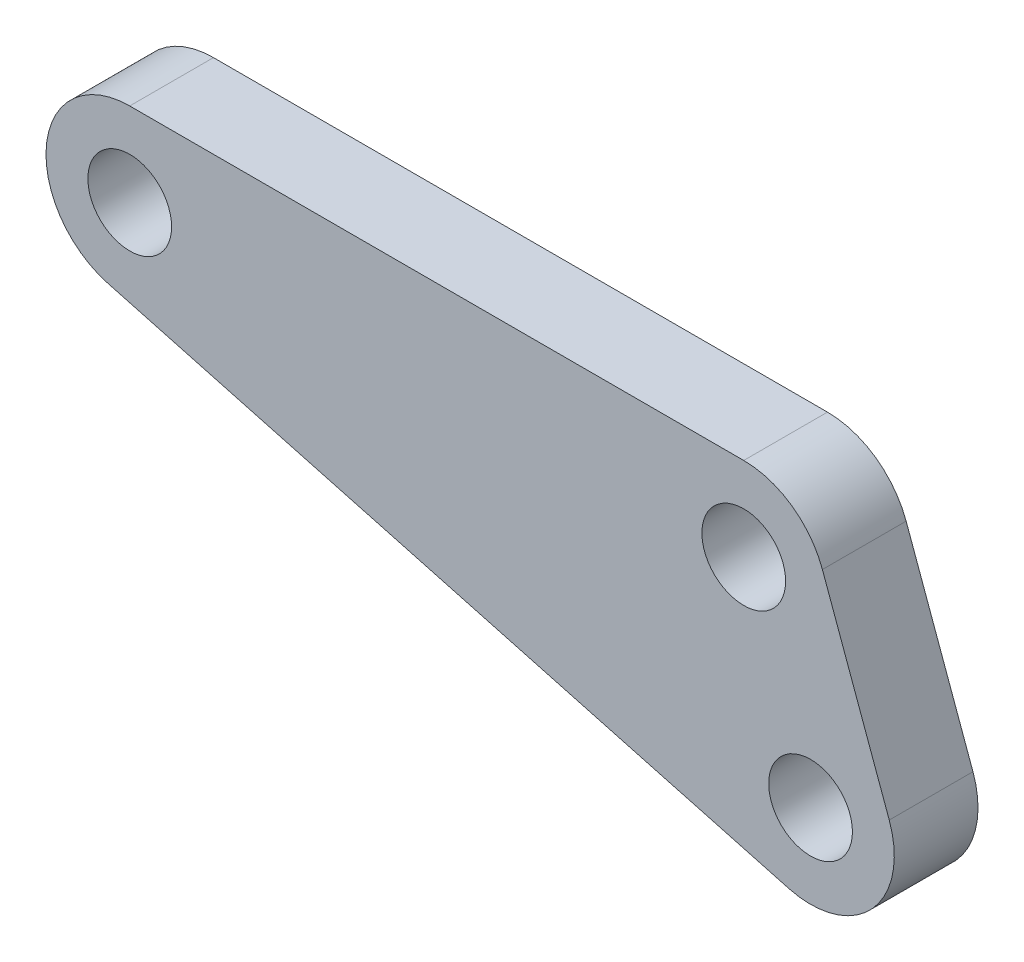
ISO-10303-21;
HEADER;
FILE_DESCRIPTION(('STEP AP214'),'2;1');
FILE_NAME('part.step','',(''),(''),'','','');
FILE_SCHEMA(('AUTOMOTIVE_DESIGN { 1 0 10303 214 1 1 1 1 }'));
ENDSEC;
DATA;
#1=APPLICATION_CONTEXT('core data for automotive mechanical design processes');
#2=APPLICATION_PROTOCOL_DEFINITION('international standard','automotive_design',2000,#1);
#3=PRODUCT_CONTEXT('',#1,'mechanical');
#4=PRODUCT('Part','Part','',(#3));
#5=PRODUCT_RELATED_PRODUCT_CATEGORY('part','',(#4));
#6=PRODUCT_DEFINITION_FORMATION('','',#4);
#7=PRODUCT_DEFINITION_CONTEXT('part definition',#1,'design');
#8=PRODUCT_DEFINITION('design','',#6,#7);
#9=PRODUCT_DEFINITION_SHAPE('','',#8);
#10=(LENGTH_UNIT() NAMED_UNIT(*) SI_UNIT(.MILLI.,.METRE.));
#11=(NAMED_UNIT(*) PLANE_ANGLE_UNIT() SI_UNIT($,.RADIAN.));
#12=(NAMED_UNIT(*) SI_UNIT($,.STERADIAN.) SOLID_ANGLE_UNIT());
#13=UNCERTAINTY_MEASURE_WITH_UNIT(LENGTH_MEASURE(1.E-05),#10,'distance_accuracy_value','');
#14=(GEOMETRIC_REPRESENTATION_CONTEXT(3) GLOBAL_UNCERTAINTY_ASSIGNED_CONTEXT((#13)) GLOBAL_UNIT_ASSIGNED_CONTEXT((#10,
#11,#12)) REPRESENTATION_CONTEXT('',''));
#15=CARTESIAN_POINT('',(0.,0.,0.));
#16=DIRECTION('',(0.,0.,1.));
#17=DIRECTION('',(1.,0.,0.));
#18=AXIS2_PLACEMENT_3D('',#15,#16,#17);
#19=CARTESIAN_POINT('',(0.,0.,3.));
#20=DIRECTION('',(0.,0.,1.));
#21=DIRECTION('',(1.,0.,0.));
#22=AXIS2_PLACEMENT_3D('',#19,#20,#21);
#23=PLANE('',#22);
#24=CARTESIAN_POINT('',(0.,0.,3.));
#25=DIRECTION('',(0.,0.,1.));
#26=DIRECTION('',(1.,0.,0.));
#27=AXIS2_PLACEMENT_3D('',#24,#25,#26);
#28=CIRCLE('',#27,1.5);
#29=CARTESIAN_POINT('',(1.5,0.,3.));
#30=VERTEX_POINT('',#29);
#31=EDGE_CURVE('E207',#30,#30,#28,.T.);
#32=ORIENTED_EDGE('',*,*,#31,.F.);
#33=EDGE_LOOP('',(#32));
#34=FACE_BOUND('',#33,.T.);
#35=CARTESIAN_POINT('',(0.,0.,3.));
#36=DIRECTION('',(0.,0.,1.));
#37=DIRECTION('',(1.,0.,0.));
#38=AXIS2_PLACEMENT_3D('',#35,#36,#37);
#39=CIRCLE('',#38,3.);
#40=CARTESIAN_POINT('',(2.81907786235772,1.02606042997702,3.));
#41=VERTEX_POINT('',#40);
#42=CARTESIAN_POINT('',(0.,3.,3.));
#43=VERTEX_POINT('',#42);
#44=EDGE_CURVE('E146',#41,#43,#39,.T.);
#45=ORIENTED_EDGE('',*,*,#44,.T.);
#46=DIRECTION('',(-1.,0.,0.));
#47=VECTOR('',#46,1.);
#48=CARTESIAN_POINT('',(-22.,3.,3.));
#49=LINE('',#48,#47);
#50=CARTESIAN_POINT('',(-22.,3.,3.));
#51=VERTEX_POINT('',#50);
#52=EDGE_CURVE('E94',#43,#51,#49,.T.);
#53=ORIENTED_EDGE('',*,*,#52,.T.);
#54=CARTESIAN_POINT('',(-22.,0.,3.));
#55=DIRECTION('',(0.,0.,1.));
#56=DIRECTION('',(1.,0.,0.));
#57=AXIS2_PLACEMENT_3D('',#54,#55,#56);
#58=CIRCLE('',#57,3.);
#59=CARTESIAN_POINT('',(-22.7810490918188,-2.89654316663313,3.));
#60=VERTEX_POINT('',#59);
#61=EDGE_CURVE('E107',#51,#60,#58,.T.);
#62=ORIENTED_EDGE('',*,*,#61,.T.);
#63=DIRECTION('',(0.965514388877709,-0.260349697272927,0.));
#64=VECTOR('',#63,1.);
#65=CARTESIAN_POINT('',(1.61309191146093,-9.47439151213448,3.));
#66=LINE('',#65,#64);
#67=CARTESIAN_POINT('',(1.61309191146093,-9.47439151213448,3.));
#68=VERTEX_POINT('',#67);
#69=EDGE_CURVE('E101',#60,#68,#66,.T.);
#70=ORIENTED_EDGE('',*,*,#69,.T.);
#71=CARTESIAN_POINT('',(2.39414100327971,-6.57784834550135,3.));
#72=DIRECTION('',(0.,0.,1.));
#73=DIRECTION('',(1.,0.,0.));
#74=AXIS2_PLACEMENT_3D('',#71,#72,#73);
#75=CIRCLE('',#74,3.);
#76=CARTESIAN_POINT('',(5.21321886563743,-5.55178791552433,3.));
#77=VERTEX_POINT('',#76);
#78=EDGE_CURVE('E105',#68,#77,#75,.T.);
#79=ORIENTED_EDGE('',*,*,#78,.T.);
#80=DIRECTION('',(-0.342020143325673,0.939692620785907,0.));
#81=VECTOR('',#80,1.);
#82=CARTESIAN_POINT('',(2.81907786235772,1.02606042997702,3.));
#83=LINE('',#82,#81);
#84=EDGE_CURVE('E57',#77,#41,#83,.T.);
#85=ORIENTED_EDGE('',*,*,#84,.T.);
#86=EDGE_LOOP('',(#45,#53,#62,#70,#79,#85));
#87=FACE_BOUND('',#86,.T.);
#88=CARTESIAN_POINT('',(-22.,0.,3.));
#89=DIRECTION('',(0.,0.,1.));
#90=DIRECTION('',(1.,0.,0.));
#91=AXIS2_PLACEMENT_3D('',#88,#89,#90);
#92=CIRCLE('',#91,1.5);
#93=CARTESIAN_POINT('',(-20.5,0.,3.));
#94=VERTEX_POINT('',#93);
#95=EDGE_CURVE('E134',#94,#94,#92,.T.);
#96=ORIENTED_EDGE('',*,*,#95,.F.);
#97=EDGE_LOOP('',(#96));
#98=FACE_BOUND('',#97,.T.);
#99=CARTESIAN_POINT('',(2.39414100327971,-6.57784834550135,3.));
#100=DIRECTION('',(0.,0.,1.));
#101=DIRECTION('',(1.,0.,0.));
#102=AXIS2_PLACEMENT_3D('',#99,#100,#101);
#103=CIRCLE('',#102,1.5);
#104=CARTESIAN_POINT('',(3.89414100327971,-6.57784834550135,3.));
#105=VERTEX_POINT('',#104);
#106=EDGE_CURVE('E196',#105,#105,#103,.T.);
#107=ORIENTED_EDGE('',*,*,#106,.F.);
#108=EDGE_LOOP('',(#107));
#109=FACE_BOUND('',#108,.T.);
#110=ADVANCED_FACE('F39',(#34,#87,#98,#109),#23,.T.);
#111=CARTESIAN_POINT('',(0.,0.,0.));
#112=DIRECTION('',(0.,0.,1.));
#113=DIRECTION('',(1.,0.,0.));
#114=AXIS2_PLACEMENT_3D('',#111,#112,#113);
#115=PLANE('',#114);
#116=CARTESIAN_POINT('',(0.,0.,0.));
#117=DIRECTION('',(0.,0.,1.));
#118=DIRECTION('',(1.,0.,0.));
#119=AXIS2_PLACEMENT_3D('',#116,#117,#118);
#120=CIRCLE('',#119,3.);
#121=CARTESIAN_POINT('',(2.81907786235772,1.02606042997702,0.));
#122=VERTEX_POINT('',#121);
#123=CARTESIAN_POINT('',(0.,3.,0.));
#124=VERTEX_POINT('',#123);
#125=EDGE_CURVE('E129',#122,#124,#120,.T.);
#126=ORIENTED_EDGE('',*,*,#125,.F.);
#127=DIRECTION('',(-0.342020143325673,0.939692620785907,0.));
#128=VECTOR('',#127,1.);
#129=CARTESIAN_POINT('',(2.81907786235772,1.02606042997702,0.));
#130=LINE('',#129,#128);
#131=CARTESIAN_POINT('',(5.21321886563743,-5.55178791552433,0.));
#132=VERTEX_POINT('',#131);
#133=EDGE_CURVE('E86',#132,#122,#130,.T.);
#134=ORIENTED_EDGE('',*,*,#133,.F.);
#135=CARTESIAN_POINT('',(2.39414100327971,-6.57784834550135,0.));
#136=DIRECTION('',(0.,0.,1.));
#137=DIRECTION('',(1.,0.,0.));
#138=AXIS2_PLACEMENT_3D('',#135,#136,#137);
#139=CIRCLE('',#138,3.);
#140=CARTESIAN_POINT('',(1.61309191146093,-9.47439151213448,0.));
#141=VERTEX_POINT('',#140);
#142=EDGE_CURVE('E80',#141,#132,#139,.T.);
#143=ORIENTED_EDGE('',*,*,#142,.F.);
#144=DIRECTION('',(0.965514388877709,-0.260349697272927,0.));
#145=VECTOR('',#144,1.);
#146=CARTESIAN_POINT('',(1.61309191146093,-9.47439151213448,0.));
#147=LINE('',#146,#145);
#148=CARTESIAN_POINT('',(-22.7810490918188,-2.89654316663313,0.));
#149=VERTEX_POINT('',#148);
#150=EDGE_CURVE('E116',#149,#141,#147,.T.);
#151=ORIENTED_EDGE('',*,*,#150,.F.);
#152=CARTESIAN_POINT('',(-22.,0.,0.));
#153=DIRECTION('',(0.,0.,1.));
#154=DIRECTION('',(1.,0.,0.));
#155=AXIS2_PLACEMENT_3D('',#152,#153,#154);
#156=CIRCLE('',#155,3.);
#157=CARTESIAN_POINT('',(-22.,3.,0.));
#158=VERTEX_POINT('',#157);
#159=EDGE_CURVE('E137',#158,#149,#156,.T.);
#160=ORIENTED_EDGE('',*,*,#159,.F.);
#161=DIRECTION('',(-1.,0.,0.));
#162=VECTOR('',#161,1.);
#163=CARTESIAN_POINT('',(-22.,3.,0.));
#164=LINE('',#163,#162);
#165=EDGE_CURVE('E133',#124,#158,#164,.T.);
#166=ORIENTED_EDGE('',*,*,#165,.F.);
#167=EDGE_LOOP('',(#126,#134,#143,#151,#160,#166));
#168=FACE_BOUND('',#167,.T.);
#169=CARTESIAN_POINT('',(-22.,0.,0.));
#170=DIRECTION('',(0.,0.,1.));
#171=DIRECTION('',(1.,0.,0.));
#172=AXIS2_PLACEMENT_3D('',#169,#170,#171);
#173=CIRCLE('',#172,1.5);
#174=CARTESIAN_POINT('',(-20.5,0.,0.));
#175=VERTEX_POINT('',#174);
#176=EDGE_CURVE('E211',#175,#175,#173,.T.);
#177=ORIENTED_EDGE('',*,*,#176,.T.);
#178=EDGE_LOOP('',(#177));
#179=FACE_BOUND('',#178,.T.);
#180=CARTESIAN_POINT('',(0.,0.,0.));
#181=DIRECTION('',(0.,0.,1.));
#182=DIRECTION('',(1.,0.,0.));
#183=AXIS2_PLACEMENT_3D('',#180,#181,#182);
#184=CIRCLE('',#183,1.5);
#185=CARTESIAN_POINT('',(1.5,0.,0.));
#186=VERTEX_POINT('',#185);
#187=EDGE_CURVE('E204',#186,#186,#184,.T.);
#188=ORIENTED_EDGE('',*,*,#187,.T.);
#189=EDGE_LOOP('',(#188));
#190=FACE_BOUND('',#189,.T.);
#191=CARTESIAN_POINT('',(2.39414100327971,-6.57784834550135,0.));
#192=DIRECTION('',(0.,0.,1.));
#193=DIRECTION('',(1.,0.,0.));
#194=AXIS2_PLACEMENT_3D('',#191,#192,#193);
#195=CIRCLE('',#194,1.5);
#196=CARTESIAN_POINT('',(3.89414100327971,-6.57784834550135,0.));
#197=VERTEX_POINT('',#196);
#198=EDGE_CURVE('E199',#197,#197,#195,.T.);
#199=ORIENTED_EDGE('',*,*,#198,.T.);
#200=EDGE_LOOP('',(#199));
#201=FACE_BOUND('',#200,.T.);
#202=ADVANCED_FACE('F159',(#168,#179,#190,#201),#115,.F.);
#203=CARTESIAN_POINT('',(0.,0.,3.));
#204=DIRECTION('',(0.,0.,-1.));
#205=DIRECTION('',(-1.,0.,0.));
#206=AXIS2_PLACEMENT_3D('',#203,#204,#205);
#207=CYLINDRICAL_SURFACE('',#206,3.);
#208=ORIENTED_EDGE('',*,*,#125,.T.);
#209=DIRECTION('',(0.,0.,-1.));
#210=VECTOR('',#209,1.);
#211=CARTESIAN_POINT('',(0.,3.,3.));
#212=LINE('',#211,#210);
#213=EDGE_CURVE('E11',#43,#124,#212,.T.);
#214=ORIENTED_EDGE('',*,*,#213,.F.);
#215=ORIENTED_EDGE('',*,*,#44,.F.);
#216=DIRECTION('',(0.,0.,-1.));
#217=VECTOR('',#216,1.);
#218=CARTESIAN_POINT('',(2.81907786235772,1.02606042997702,3.));
#219=LINE('',#218,#217);
#220=EDGE_CURVE('E125',#41,#122,#219,.T.);
#221=ORIENTED_EDGE('',*,*,#220,.T.);
#222=EDGE_LOOP('',(#208,#214,#215,#221));
#223=FACE_BOUND('',#222,.T.);
#224=ADVANCED_FACE('F41',(#223),#207,.T.);
#225=CARTESIAN_POINT('',(-22.,3.,3.));
#226=DIRECTION('',(0.,-1.,0.));
#227=DIRECTION('',(1.,0.,0.));
#228=AXIS2_PLACEMENT_3D('',#225,#226,#227);
#229=PLANE('',#228);
#230=ORIENTED_EDGE('',*,*,#165,.T.);
#231=DIRECTION('',(0.,0.,-1.));
#232=VECTOR('',#231,1.);
#233=CARTESIAN_POINT('',(-22.,3.,3.));
#234=LINE('',#233,#232);
#235=EDGE_CURVE('E49',#51,#158,#234,.T.);
#236=ORIENTED_EDGE('',*,*,#235,.F.);
#237=ORIENTED_EDGE('',*,*,#52,.F.);
#238=ORIENTED_EDGE('',*,*,#213,.T.);
#239=EDGE_LOOP('',(#230,#236,#237,#238));
#240=FACE_BOUND('',#239,.T.);
#241=ADVANCED_FACE('F267',(#240),#229,.F.);
#242=CARTESIAN_POINT('',(-22.,0.,3.));
#243=DIRECTION('',(0.,0.,-1.));
#244=DIRECTION('',(-1.,0.,0.));
#245=AXIS2_PLACEMENT_3D('',#242,#243,#244);
#246=CYLINDRICAL_SURFACE('',#245,3.);
#247=ORIENTED_EDGE('',*,*,#159,.T.);
#248=DIRECTION('',(0.,0.,-1.));
#249=VECTOR('',#248,1.);
#250=CARTESIAN_POINT('',(-22.7810490918188,-2.89654316663313,3.));
#251=LINE('',#250,#249);
#252=EDGE_CURVE('E118',#60,#149,#251,.T.);
#253=ORIENTED_EDGE('',*,*,#252,.F.);
#254=ORIENTED_EDGE('',*,*,#61,.F.);
#255=ORIENTED_EDGE('',*,*,#235,.T.);
#256=EDGE_LOOP('',(#247,#253,#254,#255));
#257=FACE_BOUND('',#256,.T.);
#258=ADVANCED_FACE('F156',(#257),#246,.T.);
#259=CARTESIAN_POINT('',(1.61309191146093,-9.47439151213448,3.));
#260=DIRECTION('',(0.260349697272927,0.965514388877709,0.));
#261=DIRECTION('',(-0.965514388877709,0.260349697272927,0.));
#262=AXIS2_PLACEMENT_3D('',#259,#260,#261);
#263=PLANE('',#262);
#264=ORIENTED_EDGE('',*,*,#150,.T.);
#265=DIRECTION('',(0.,0.,-1.));
#266=VECTOR('',#265,1.);
#267=CARTESIAN_POINT('',(1.61309191146093,-9.47439151213448,3.));
#268=LINE('',#267,#266);
#269=EDGE_CURVE('E113',#68,#141,#268,.T.);
#270=ORIENTED_EDGE('',*,*,#269,.F.);
#271=ORIENTED_EDGE('',*,*,#69,.F.);
#272=ORIENTED_EDGE('',*,*,#252,.T.);
#273=EDGE_LOOP('',(#264,#270,#271,#272));
#274=FACE_BOUND('',#273,.T.);
#275=ADVANCED_FACE('F114',(#274),#263,.F.);
#276=CARTESIAN_POINT('',(2.39414100327971,-6.57784834550135,3.));
#277=DIRECTION('',(0.,0.,-1.));
#278=DIRECTION('',(-1.,0.,0.));
#279=AXIS2_PLACEMENT_3D('',#276,#277,#278);
#280=CYLINDRICAL_SURFACE('',#279,3.);
#281=ORIENTED_EDGE('',*,*,#142,.T.);
#282=DIRECTION('',(0.,0.,-1.));
#283=VECTOR('',#282,1.);
#284=CARTESIAN_POINT('',(5.21321886563743,-5.55178791552433,3.));
#285=LINE('',#284,#283);
#286=EDGE_CURVE('E119',#77,#132,#285,.T.);
#287=ORIENTED_EDGE('',*,*,#286,.F.);
#288=ORIENTED_EDGE('',*,*,#78,.F.);
#289=ORIENTED_EDGE('',*,*,#269,.T.);
#290=EDGE_LOOP('',(#281,#287,#288,#289));
#291=FACE_BOUND('',#290,.T.);
#292=ADVANCED_FACE('F121',(#291),#280,.T.);
#293=CARTESIAN_POINT('',(2.81907786235772,1.02606042997702,3.));
#294=DIRECTION('',(-0.939692620785907,-0.342020143325673,0.));
#295=DIRECTION('',(0.342020143325673,-0.939692620785907,0.));
#296=AXIS2_PLACEMENT_3D('',#293,#294,#295);
#297=PLANE('',#296);
#298=ORIENTED_EDGE('',*,*,#133,.T.);
#299=ORIENTED_EDGE('',*,*,#220,.F.);
#300=ORIENTED_EDGE('',*,*,#84,.F.);
#301=ORIENTED_EDGE('',*,*,#286,.T.);
#302=EDGE_LOOP('',(#298,#299,#300,#301));
#303=FACE_BOUND('',#302,.T.);
#304=ADVANCED_FACE('F164',(#303),#297,.F.);
#305=CARTESIAN_POINT('',(-22.,0.,3.));
#306=DIRECTION('',(0.,0.,-1.));
#307=DIRECTION('',(-1.,0.,0.));
#308=AXIS2_PLACEMENT_3D('',#305,#306,#307);
#309=CYLINDRICAL_SURFACE('',#308,1.5);
#310=ORIENTED_EDGE('',*,*,#95,.T.);
#311=EDGE_LOOP('',(#310));
#312=FACE_BOUND('',#311,.T.);
#313=ORIENTED_EDGE('',*,*,#176,.F.);
#314=EDGE_LOOP('',(#313));
#315=FACE_BOUND('',#314,.T.);
#316=ADVANCED_FACE('F166',(#312,#315),#309,.F.);
#317=CARTESIAN_POINT('',(0.,0.,3.));
#318=DIRECTION('',(0.,0.,-1.));
#319=DIRECTION('',(-1.,0.,0.));
#320=AXIS2_PLACEMENT_3D('',#317,#318,#319);
#321=CYLINDRICAL_SURFACE('',#320,1.5);
#322=ORIENTED_EDGE('',*,*,#31,.T.);
#323=EDGE_LOOP('',(#322));
#324=FACE_BOUND('',#323,.T.);
#325=ORIENTED_EDGE('',*,*,#187,.F.);
#326=EDGE_LOOP('',(#325));
#327=FACE_BOUND('',#326,.T.);
#328=ADVANCED_FACE('F172',(#324,#327),#321,.F.);
#329=CARTESIAN_POINT('',(2.39414100327971,-6.57784834550135,3.));
#330=DIRECTION('',(0.,0.,-1.));
#331=DIRECTION('',(-1.,0.,0.));
#332=AXIS2_PLACEMENT_3D('',#329,#330,#331);
#333=CYLINDRICAL_SURFACE('',#332,1.5);
#334=ORIENTED_EDGE('',*,*,#106,.T.);
#335=EDGE_LOOP('',(#334));
#336=FACE_BOUND('',#335,.T.);
#337=ORIENTED_EDGE('',*,*,#198,.F.);
#338=EDGE_LOOP('',(#337));
#339=FACE_BOUND('',#338,.T.);
#340=ADVANCED_FACE('F187',(#336,#339),#333,.F.);
#341=CLOSED_SHELL('',(#110,#202,#224,#241,#258,#275,#292,#304,#316,#328,#340));
#342=MANIFOLD_SOLID_BREP('B2',#341);
#343=ADVANCED_BREP_SHAPE_REPRESENTATION('',(#18,#342),#14);
#344=SHAPE_DEFINITION_REPRESENTATION(#9,#343);
ENDSEC;
END-ISO-10303-21;
